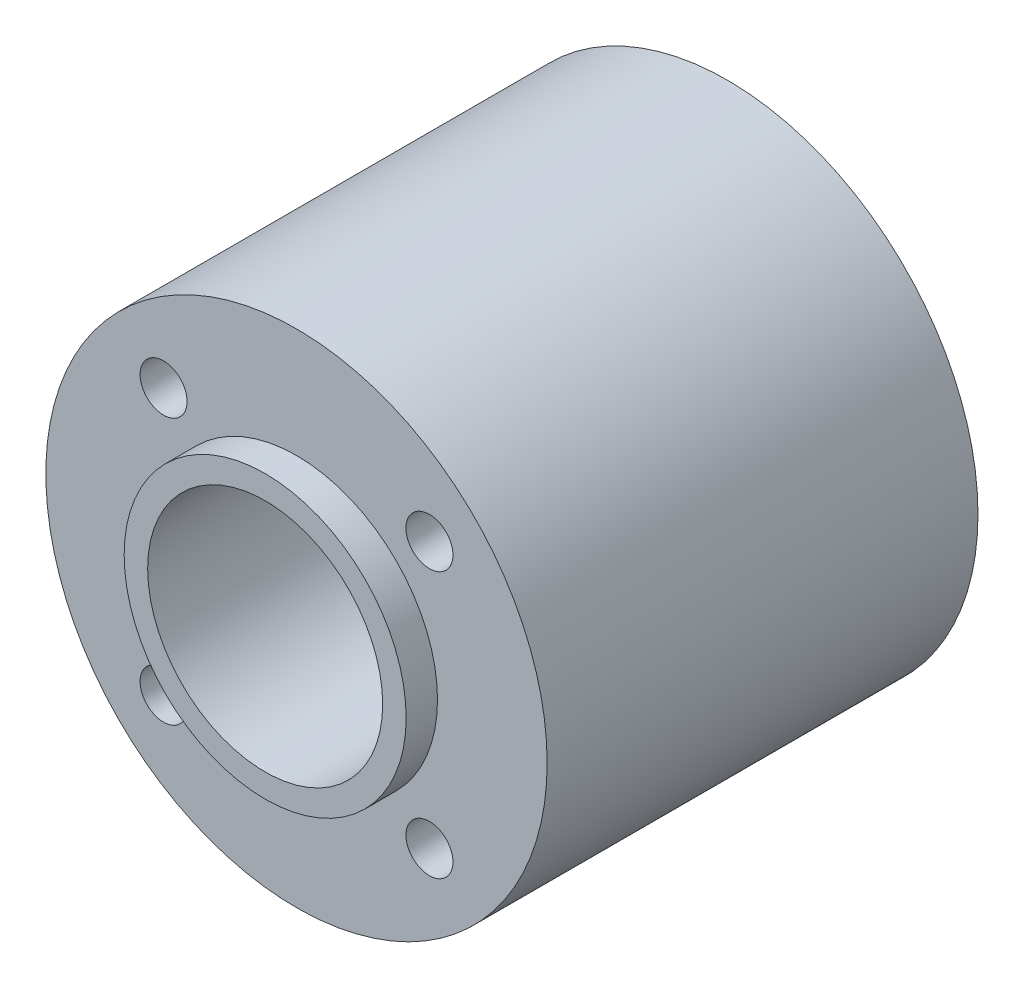
ISO-10303-21;
HEADER;
FILE_DESCRIPTION(('STEP AP214'),'2;1');
FILE_NAME('part.step','',(''),(''),'','','');
FILE_SCHEMA(('AUTOMOTIVE_DESIGN { 1 0 10303 214 1 1 1 1 }'));
ENDSEC;
DATA;
#1=APPLICATION_CONTEXT('core data for automotive mechanical design processes');
#2=APPLICATION_PROTOCOL_DEFINITION('international standard','automotive_design',2000,#1);
#3=PRODUCT_CONTEXT('',#1,'mechanical');
#4=PRODUCT('Part','Part','',(#3));
#5=PRODUCT_RELATED_PRODUCT_CATEGORY('part','',(#4));
#6=PRODUCT_DEFINITION_FORMATION('','',#4);
#7=PRODUCT_DEFINITION_CONTEXT('part definition',#1,'design');
#8=PRODUCT_DEFINITION('design','',#6,#7);
#9=PRODUCT_DEFINITION_SHAPE('','',#8);
#10=(LENGTH_UNIT() NAMED_UNIT(*) SI_UNIT(.MILLI.,.METRE.));
#11=(NAMED_UNIT(*) PLANE_ANGLE_UNIT() SI_UNIT($,.RADIAN.));
#12=(NAMED_UNIT(*) SI_UNIT($,.STERADIAN.) SOLID_ANGLE_UNIT());
#13=UNCERTAINTY_MEASURE_WITH_UNIT(LENGTH_MEASURE(1.E-05),#10,'distance_accuracy_value','');
#14=(GEOMETRIC_REPRESENTATION_CONTEXT(3) GLOBAL_UNCERTAINTY_ASSIGNED_CONTEXT((#13)) GLOBAL_UNIT_ASSIGNED_CONTEXT((#10,
#11,#12)) REPRESENTATION_CONTEXT('',''));
#15=CARTESIAN_POINT('',(0.,0.,0.));
#16=DIRECTION('',(0.,0.,1.));
#17=DIRECTION('',(1.,0.,0.));
#18=AXIS2_PLACEMENT_3D('',#15,#16,#17);
#19=CARTESIAN_POINT('',(0.,0.,13.75));
#20=DIRECTION('',(0.,0.,1.));
#21=DIRECTION('',(1.,0.,0.));
#22=AXIS2_PLACEMENT_3D('',#19,#20,#21);
#23=PLANE('',#22);
#24=CARTESIAN_POINT('',(0.,0.,13.75));
#25=DIRECTION('',(0.,0.,1.));
#26=DIRECTION('',(1.,0.,0.));
#27=AXIS2_PLACEMENT_3D('',#24,#25,#26);
#28=CIRCLE('',#27,16.);
#29=CARTESIAN_POINT('',(16.,0.,13.75));
#30=VERTEX_POINT('',#29);
#31=EDGE_CURVE('E10',#30,#30,#28,.T.);
#32=ORIENTED_EDGE('',*,*,#31,.T.);
#33=EDGE_LOOP('',(#32));
#34=FACE_BOUND('',#33,.T.);
#35=CARTESIAN_POINT('',(-8.48528137423856,8.48528137423858,13.75));
#36=DIRECTION('',(0.,0.,1.));
#37=DIRECTION('',(1.,0.,0.));
#38=AXIS2_PLACEMENT_3D('',#35,#36,#37);
#39=CIRCLE('',#38,1.5);
#40=CARTESIAN_POINT('',(-6.98528137423856,8.48528137423858,13.75));
#41=VERTEX_POINT('',#40);
#42=EDGE_CURVE('E43',#41,#41,#39,.T.);
#43=ORIENTED_EDGE('',*,*,#42,.F.);
#44=EDGE_LOOP('',(#43));
#45=FACE_BOUND('',#44,.T.);
#46=CARTESIAN_POINT('',(8.48528137423861,8.48528137423853,13.75));
#47=DIRECTION('',(0.,0.,1.));
#48=DIRECTION('',(1.,0.,0.));
#49=AXIS2_PLACEMENT_3D('',#46,#47,#48);
#50=CIRCLE('',#49,1.5);
#51=CARTESIAN_POINT('',(9.98528137423861,8.48528137423853,13.75));
#52=VERTEX_POINT('',#51);
#53=EDGE_CURVE('E50',#52,#52,#50,.T.);
#54=ORIENTED_EDGE('',*,*,#53,.F.);
#55=EDGE_LOOP('',(#54));
#56=FACE_BOUND('',#55,.T.);
#57=CARTESIAN_POINT('',(-8.48528137423867,-8.48528137423847,13.75));
#58=DIRECTION('',(0.,0.,1.));
#59=DIRECTION('',(1.,0.,0.));
#60=AXIS2_PLACEMENT_3D('',#57,#58,#59);
#61=CIRCLE('',#60,1.5);
#62=CARTESIAN_POINT('',(-6.98528137423867,-8.48528137423847,13.75));
#63=VERTEX_POINT('',#62);
#64=EDGE_CURVE('E59',#63,#63,#61,.T.);
#65=ORIENTED_EDGE('',*,*,#64,.F.);
#66=EDGE_LOOP('',(#65));
#67=FACE_BOUND('',#66,.T.);
#68=CARTESIAN_POINT('',(8.48528137423856,-8.48528137423858,13.75));
#69=DIRECTION('',(0.,0.,1.));
#70=DIRECTION('',(1.,0.,0.));
#71=AXIS2_PLACEMENT_3D('',#68,#69,#70);
#72=CIRCLE('',#71,1.5);
#73=CARTESIAN_POINT('',(9.98528137423856,-8.48528137423858,13.75));
#74=VERTEX_POINT('',#73);
#75=EDGE_CURVE('E56',#74,#74,#72,.T.);
#76=ORIENTED_EDGE('',*,*,#75,.F.);
#77=EDGE_LOOP('',(#76));
#78=FACE_BOUND('',#77,.T.);
#79=CARTESIAN_POINT('',(0.,0.,13.75));
#80=DIRECTION('',(0.,0.,1.));
#81=DIRECTION('',(1.,0.,0.));
#82=AXIS2_PLACEMENT_3D('',#79,#80,#81);
#83=CIRCLE('',#82,9.);
#84=CARTESIAN_POINT('',(9.,0.,13.75));
#85=VERTEX_POINT('',#84);
#86=EDGE_CURVE('E69',#85,#85,#83,.T.);
#87=ORIENTED_EDGE('',*,*,#86,.F.);
#88=EDGE_LOOP('',(#87));
#89=FACE_BOUND('',#88,.T.);
#90=ADVANCED_FACE('F32',(#34,#45,#56,#67,#78,#89),#23,.T.);
#91=CARTESIAN_POINT('',(0.,0.,13.75));
#92=DIRECTION('',(0.,0.,-1.));
#93=DIRECTION('',(-1.,0.,0.));
#94=AXIS2_PLACEMENT_3D('',#91,#92,#93);
#95=CYLINDRICAL_SURFACE('',#94,16.);
#96=ORIENTED_EDGE('',*,*,#31,.F.);
#97=EDGE_LOOP('',(#96));
#98=FACE_BOUND('',#97,.T.);
#99=CARTESIAN_POINT('',(0.,0.,-13.75));
#100=DIRECTION('',(0.,0.,1.));
#101=DIRECTION('',(1.,0.,0.));
#102=AXIS2_PLACEMENT_3D('',#99,#100,#101);
#103=CIRCLE('',#102,16.);
#104=CARTESIAN_POINT('',(16.,0.,-13.75));
#105=VERTEX_POINT('',#104);
#106=EDGE_CURVE('E36',#105,#105,#103,.T.);
#107=ORIENTED_EDGE('',*,*,#106,.T.);
#108=EDGE_LOOP('',(#107));
#109=FACE_BOUND('',#108,.T.);
#110=ADVANCED_FACE('F34',(#98,#109),#95,.T.);
#111=CARTESIAN_POINT('',(0.,0.,13.75));
#112=DIRECTION('',(0.,0.,-1.));
#113=DIRECTION('',(-1.,0.,0.));
#114=AXIS2_PLACEMENT_3D('',#111,#112,#113);
#115=CYLINDRICAL_SURFACE('',#114,7.5);
#116=CARTESIAN_POINT('',(0.,0.,15.75));
#117=DIRECTION('',(0.,0.,1.));
#118=DIRECTION('',(1.,0.,0.));
#119=AXIS2_PLACEMENT_3D('',#116,#117,#118);
#120=CIRCLE('',#119,7.5);
#121=CARTESIAN_POINT('',(7.5,0.,15.75));
#122=VERTEX_POINT('',#121);
#123=EDGE_CURVE('E72',#122,#122,#120,.T.);
#124=ORIENTED_EDGE('',*,*,#123,.T.);
#125=EDGE_LOOP('',(#124));
#126=FACE_BOUND('',#125,.T.);
#127=CARTESIAN_POINT('',(0.,0.,-15.75));
#128=DIRECTION('',(0.,0.,1.));
#129=DIRECTION('',(1.,0.,0.));
#130=AXIS2_PLACEMENT_3D('',#127,#128,#129);
#131=CIRCLE('',#130,7.5);
#132=CARTESIAN_POINT('',(7.5,0.,-15.75));
#133=VERTEX_POINT('',#132);
#134=EDGE_CURVE('E81',#133,#133,#131,.T.);
#135=ORIENTED_EDGE('',*,*,#134,.F.);
#136=EDGE_LOOP('',(#135));
#137=FACE_BOUND('',#136,.T.);
#138=ADVANCED_FACE('F90',(#126,#137),#115,.F.);
#139=CARTESIAN_POINT('',(0.,0.,-13.75));
#140=DIRECTION('',(0.,0.,1.));
#141=DIRECTION('',(1.,0.,0.));
#142=AXIS2_PLACEMENT_3D('',#139,#140,#141);
#143=PLANE('',#142);
#144=CARTESIAN_POINT('',(0.,0.,-13.75));
#145=DIRECTION('',(0.,0.,1.));
#146=DIRECTION('',(1.,0.,0.));
#147=AXIS2_PLACEMENT_3D('',#144,#145,#146);
#148=CIRCLE('',#147,9.);
#149=CARTESIAN_POINT('',(9.,0.,-13.75));
#150=VERTEX_POINT('',#149);
#151=EDGE_CURVE('E78',#150,#150,#148,.T.);
#152=ORIENTED_EDGE('',*,*,#151,.T.);
#153=EDGE_LOOP('',(#152));
#154=FACE_BOUND('',#153,.T.);
#155=CARTESIAN_POINT('',(8.48528137423856,-8.48528137423858,-13.75));
#156=DIRECTION('',(0.,0.,1.));
#157=DIRECTION('',(-1.,0.,0.));
#158=AXIS2_PLACEMENT_3D('',#155,#156,#157);
#159=CIRCLE('',#158,1.5);
#160=CARTESIAN_POINT('',(6.98528137423856,-8.48528137423858,-13.75));
#161=VERTEX_POINT('',#160);
#162=EDGE_CURVE('E62',#161,#161,#159,.T.);
#163=ORIENTED_EDGE('',*,*,#162,.T.);
#164=EDGE_LOOP('',(#163));
#165=FACE_BOUND('',#164,.T.);
#166=CARTESIAN_POINT('',(-8.48528137423867,-8.48528137423847,-13.75));
#167=DIRECTION('',(0.,0.,1.));
#168=DIRECTION('',(0.,1.,0.));
#169=AXIS2_PLACEMENT_3D('',#166,#167,#168);
#170=CIRCLE('',#169,1.5);
#171=CARTESIAN_POINT('',(-8.48528137423866,-6.98528137423847,-13.75));
#172=VERTEX_POINT('',#171);
#173=EDGE_CURVE('E63',#172,#172,#170,.T.);
#174=ORIENTED_EDGE('',*,*,#173,.T.);
#175=EDGE_LOOP('',(#174));
#176=FACE_BOUND('',#175,.T.);
#177=CARTESIAN_POINT('',(8.48528137423861,8.48528137423853,-13.75));
#178=DIRECTION('',(0.,0.,1.));
#179=DIRECTION('',(0.,-1.,0.));
#180=AXIS2_PLACEMENT_3D('',#177,#178,#179);
#181=CIRCLE('',#180,1.5);
#182=CARTESIAN_POINT('',(8.48528137423861,6.98528137423853,-13.75));
#183=VERTEX_POINT('',#182);
#184=EDGE_CURVE('E53',#183,#183,#181,.T.);
#185=ORIENTED_EDGE('',*,*,#184,.T.);
#186=EDGE_LOOP('',(#185));
#187=FACE_BOUND('',#186,.T.);
#188=CARTESIAN_POINT('',(-8.48528137423856,8.48528137423858,-13.75));
#189=DIRECTION('',(0.,0.,1.));
#190=DIRECTION('',(1.,0.,0.));
#191=AXIS2_PLACEMENT_3D('',#188,#189,#190);
#192=CIRCLE('',#191,1.5);
#193=CARTESIAN_POINT('',(-6.98528137423856,8.48528137423858,-13.75));
#194=VERTEX_POINT('',#193);
#195=EDGE_CURVE('E47',#194,#194,#192,.T.);
#196=ORIENTED_EDGE('',*,*,#195,.T.);
#197=EDGE_LOOP('',(#196));
#198=FACE_BOUND('',#197,.T.);
#199=ORIENTED_EDGE('',*,*,#106,.F.);
#200=EDGE_LOOP('',(#199));
#201=FACE_BOUND('',#200,.T.);
#202=ADVANCED_FACE('F92',(#154,#165,#176,#187,#198,#201),#143,.F.);
#203=CARTESIAN_POINT('',(-8.48528137423856,8.48528137423858,-13.75));
#204=DIRECTION('',(0.,0.,1.));
#205=DIRECTION('',(1.,0.,0.));
#206=AXIS2_PLACEMENT_3D('',#203,#204,#205);
#207=CYLINDRICAL_SURFACE('',#206,1.5);
#208=ORIENTED_EDGE('',*,*,#42,.T.);
#209=EDGE_LOOP('',(#208));
#210=FACE_BOUND('',#209,.T.);
#211=ORIENTED_EDGE('',*,*,#195,.F.);
#212=EDGE_LOOP('',(#211));
#213=FACE_BOUND('',#212,.T.);
#214=ADVANCED_FACE('F98',(#210,#213),#207,.F.);
#215=CARTESIAN_POINT('',(8.48528137423861,8.48528137423853,-13.75));
#216=DIRECTION('',(0.,0.,1.));
#217=DIRECTION('',(1.,0.,0.));
#218=AXIS2_PLACEMENT_3D('',#215,#216,#217);
#219=CYLINDRICAL_SURFACE('',#218,1.5);
#220=ORIENTED_EDGE('',*,*,#53,.T.);
#221=EDGE_LOOP('',(#220));
#222=FACE_BOUND('',#221,.T.);
#223=ORIENTED_EDGE('',*,*,#184,.F.);
#224=EDGE_LOOP('',(#223));
#225=FACE_BOUND('',#224,.T.);
#226=ADVANCED_FACE('F110',(#222,#225),#219,.F.);
#227=CARTESIAN_POINT('',(-8.48528137423867,-8.48528137423847,-13.75));
#228=DIRECTION('',(0.,0.,1.));
#229=DIRECTION('',(1.,0.,0.));
#230=AXIS2_PLACEMENT_3D('',#227,#228,#229);
#231=CYLINDRICAL_SURFACE('',#230,1.5);
#232=ORIENTED_EDGE('',*,*,#64,.T.);
#233=EDGE_LOOP('',(#232));
#234=FACE_BOUND('',#233,.T.);
#235=ORIENTED_EDGE('',*,*,#173,.F.);
#236=EDGE_LOOP('',(#235));
#237=FACE_BOUND('',#236,.T.);
#238=ADVANCED_FACE('F114',(#234,#237),#231,.F.);
#239=CARTESIAN_POINT('',(8.48528137423856,-8.48528137423858,-13.75));
#240=DIRECTION('',(0.,0.,1.));
#241=DIRECTION('',(1.,0.,0.));
#242=AXIS2_PLACEMENT_3D('',#239,#240,#241);
#243=CYLINDRICAL_SURFACE('',#242,1.5);
#244=ORIENTED_EDGE('',*,*,#75,.T.);
#245=EDGE_LOOP('',(#244));
#246=FACE_BOUND('',#245,.T.);
#247=ORIENTED_EDGE('',*,*,#162,.F.);
#248=EDGE_LOOP('',(#247));
#249=FACE_BOUND('',#248,.T.);
#250=ADVANCED_FACE('F118',(#246,#249),#243,.F.);
#251=CARTESIAN_POINT('',(0.,0.,15.75));
#252=DIRECTION('',(0.,0.,1.));
#253=DIRECTION('',(1.,0.,0.));
#254=AXIS2_PLACEMENT_3D('',#251,#252,#253);
#255=PLANE('',#254);
#256=CARTESIAN_POINT('',(0.,0.,15.75));
#257=DIRECTION('',(0.,0.,1.));
#258=DIRECTION('',(1.,0.,0.));
#259=AXIS2_PLACEMENT_3D('',#256,#257,#258);
#260=CIRCLE('',#259,9.);
#261=CARTESIAN_POINT('',(9.,0.,15.75));
#262=VERTEX_POINT('',#261);
#263=EDGE_CURVE('E66',#262,#262,#260,.T.);
#264=ORIENTED_EDGE('',*,*,#263,.T.);
#265=EDGE_LOOP('',(#264));
#266=FACE_BOUND('',#265,.T.);
#267=ORIENTED_EDGE('',*,*,#123,.F.);
#268=EDGE_LOOP('',(#267));
#269=FACE_BOUND('',#268,.T.);
#270=ADVANCED_FACE('F122',(#266,#269),#255,.T.);
#271=CARTESIAN_POINT('',(0.,0.,15.75));
#272=DIRECTION('',(0.,0.,-1.));
#273=DIRECTION('',(-1.,0.,0.));
#274=AXIS2_PLACEMENT_3D('',#271,#272,#273);
#275=CYLINDRICAL_SURFACE('',#274,9.);
#276=ORIENTED_EDGE('',*,*,#263,.F.);
#277=EDGE_LOOP('',(#276));
#278=FACE_BOUND('',#277,.T.);
#279=ORIENTED_EDGE('',*,*,#86,.T.);
#280=EDGE_LOOP('',(#279));
#281=FACE_BOUND('',#280,.T.);
#282=ADVANCED_FACE('F124',(#278,#281),#275,.T.);
#283=CARTESIAN_POINT('',(0.,0.,-15.75));
#284=DIRECTION('',(0.,0.,1.));
#285=DIRECTION('',(1.,0.,0.));
#286=AXIS2_PLACEMENT_3D('',#283,#284,#285);
#287=CYLINDRICAL_SURFACE('',#286,9.);
#288=CARTESIAN_POINT('',(0.,0.,-15.75));
#289=DIRECTION('',(0.,0.,1.));
#290=DIRECTION('',(1.,0.,0.));
#291=AXIS2_PLACEMENT_3D('',#288,#289,#290);
#292=CIRCLE('',#291,9.);
#293=CARTESIAN_POINT('',(9.,0.,-15.75));
#294=VERTEX_POINT('',#293);
#295=EDGE_CURVE('E77',#294,#294,#292,.T.);
#296=ORIENTED_EDGE('',*,*,#295,.T.);
#297=EDGE_LOOP('',(#296));
#298=FACE_BOUND('',#297,.T.);
#299=ORIENTED_EDGE('',*,*,#151,.F.);
#300=EDGE_LOOP('',(#299));
#301=FACE_BOUND('',#300,.T.);
#302=ADVANCED_FACE('F127',(#298,#301),#287,.T.);
#303=CARTESIAN_POINT('',(0.,0.,-15.75));
#304=DIRECTION('',(0.,0.,-1.));
#305=DIRECTION('',(1.,0.,0.));
#306=AXIS2_PLACEMENT_3D('',#303,#304,#305);
#307=PLANE('',#306);
#308=ORIENTED_EDGE('',*,*,#134,.T.);
#309=EDGE_LOOP('',(#308));
#310=FACE_BOUND('',#309,.T.);
#311=ORIENTED_EDGE('',*,*,#295,.F.);
#312=EDGE_LOOP('',(#311));
#313=FACE_BOUND('',#312,.T.);
#314=ADVANCED_FACE('F87',(#310,#313),#307,.T.);
#315=CLOSED_SHELL('',(#90,#110,#138,#202,#214,#226,#238,#250,#270,#282,#302,#314));
#316=MANIFOLD_SOLID_BREP('B2',#315);
#317=ADVANCED_BREP_SHAPE_REPRESENTATION('',(#18,#316),#14);
#318=SHAPE_DEFINITION_REPRESENTATION(#9,#317);
ENDSEC;
END-ISO-10303-21;
